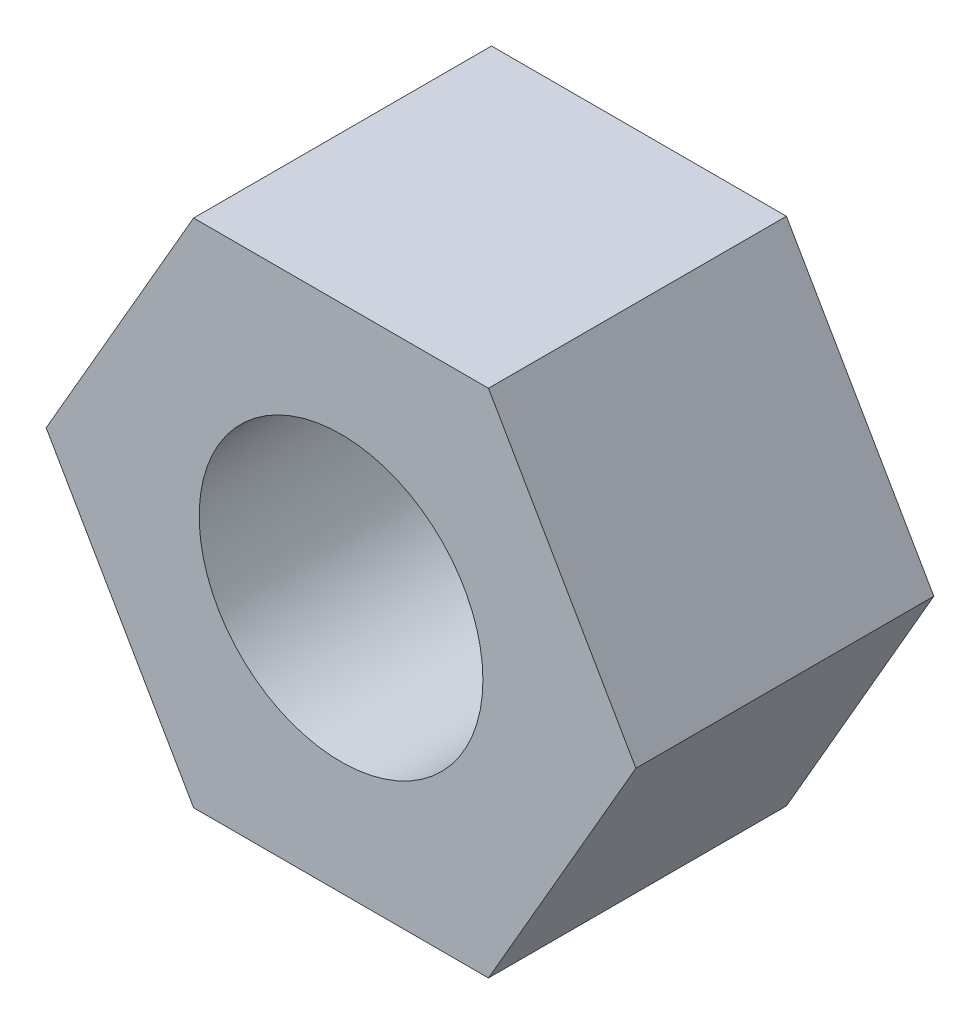
ISO-10303-21;
HEADER;
FILE_DESCRIPTION(('STEP AP214'),'2;1');
FILE_NAME('part.step','',(''),(''),'','','');
FILE_SCHEMA(('AUTOMOTIVE_DESIGN { 1 0 10303 214 1 1 1 1 }'));
ENDSEC;
DATA;
#1=APPLICATION_CONTEXT('core data for automotive mechanical design processes');
#2=APPLICATION_PROTOCOL_DEFINITION('international standard','automotive_design',2000,#1);
#3=PRODUCT_CONTEXT('',#1,'mechanical');
#4=PRODUCT('Part','Part','',(#3));
#5=PRODUCT_RELATED_PRODUCT_CATEGORY('part','',(#4));
#6=PRODUCT_DEFINITION_FORMATION('','',#4);
#7=PRODUCT_DEFINITION_CONTEXT('part definition',#1,'design');
#8=PRODUCT_DEFINITION('design','',#6,#7);
#9=PRODUCT_DEFINITION_SHAPE('','',#8);
#10=(LENGTH_UNIT() NAMED_UNIT(*) SI_UNIT(.MILLI.,.METRE.));
#11=(NAMED_UNIT(*) PLANE_ANGLE_UNIT() SI_UNIT($,.RADIAN.));
#12=(NAMED_UNIT(*) SI_UNIT($,.STERADIAN.) SOLID_ANGLE_UNIT());
#13=UNCERTAINTY_MEASURE_WITH_UNIT(LENGTH_MEASURE(1.E-05),#10,'distance_accuracy_value','');
#14=(GEOMETRIC_REPRESENTATION_CONTEXT(3) GLOBAL_UNCERTAINTY_ASSIGNED_CONTEXT((#13)) GLOBAL_UNIT_ASSIGNED_CONTEXT((#10,
#11,#12)) REPRESENTATION_CONTEXT('',''));
#15=CARTESIAN_POINT('',(0.,0.,0.));
#16=DIRECTION('',(0.,0.,1.));
#17=DIRECTION('',(1.,0.,0.));
#18=AXIS2_PLACEMENT_3D('',#15,#16,#17);
#19=CARTESIAN_POINT('',(-4.12444598552339,7.14375000000002,8.334375));
#20=DIRECTION('',(0.866025403784439,-0.5,0.));
#21=DIRECTION('',(0.5,0.866025403784439,0.));
#22=AXIS2_PLACEMENT_3D('',#19,#20,#21);
#23=PLANE('',#22);
#24=DIRECTION('',(-0.5,-0.866025403784439,0.));
#25=VECTOR('',#24,1.);
#26=CARTESIAN_POINT('',(-4.12444598552339,7.14375000000002,0.));
#27=LINE('',#26,#25);
#28=CARTESIAN_POINT('',(-4.12444598552339,7.14375000000002,0.));
#29=VERTEX_POINT('',#28);
#30=CARTESIAN_POINT('',(-8.24889197104679,0.,0.));
#31=VERTEX_POINT('',#30);
#32=EDGE_CURVE('E119',#29,#31,#27,.T.);
#33=ORIENTED_EDGE('',*,*,#32,.T.);
#34=DIRECTION('',(0.,0.,-1.));
#35=VECTOR('',#34,1.);
#36=CARTESIAN_POINT('',(-8.24889197104679,0.,8.334375));
#37=LINE('',#36,#35);
#38=CARTESIAN_POINT('',(-8.24889197104679,0.,8.334375));
#39=VERTEX_POINT('',#38);
#40=EDGE_CURVE('E11',#39,#31,#37,.T.);
#41=ORIENTED_EDGE('',*,*,#40,.F.);
#42=DIRECTION('',(-0.5,-0.866025403784439,0.));
#43=VECTOR('',#42,1.);
#44=CARTESIAN_POINT('',(-4.12444598552339,7.14375000000002,8.334375));
#45=LINE('',#44,#43);
#46=CARTESIAN_POINT('',(-4.12444598552339,7.14375000000002,8.334375));
#47=VERTEX_POINT('',#46);
#48=EDGE_CURVE('E130',#47,#39,#45,.T.);
#49=ORIENTED_EDGE('',*,*,#48,.F.);
#50=DIRECTION('',(0.,0.,-1.));
#51=VECTOR('',#50,1.);
#52=CARTESIAN_POINT('',(-4.12444598552339,7.14375000000002,8.334375));
#53=LINE('',#52,#51);
#54=EDGE_CURVE('E115',#47,#29,#53,.T.);
#55=ORIENTED_EDGE('',*,*,#54,.T.);
#56=EDGE_LOOP('',(#33,#41,#49,#55));
#57=FACE_BOUND('',#56,.T.);
#58=ADVANCED_FACE('F35',(#57),#23,.F.);
#59=CARTESIAN_POINT('',(-8.24889197104679,0.,8.334375));
#60=DIRECTION('',(0.866025403784439,0.5,0.));
#61=DIRECTION('',(-0.5,0.866025403784438,0.));
#62=AXIS2_PLACEMENT_3D('',#59,#60,#61);
#63=PLANE('',#62);
#64=DIRECTION('',(0.5,-0.866025403784438,0.));
#65=VECTOR('',#64,1.);
#66=CARTESIAN_POINT('',(-8.24889197104679,0.,0.));
#67=LINE('',#66,#65);
#68=CARTESIAN_POINT('',(-4.12444598552339,-7.14375,0.));
#69=VERTEX_POINT('',#68);
#70=EDGE_CURVE('E122',#31,#69,#67,.T.);
#71=ORIENTED_EDGE('',*,*,#70,.T.);
#72=DIRECTION('',(0.,0.,-1.));
#73=VECTOR('',#72,1.);
#74=CARTESIAN_POINT('',(-4.12444598552339,-7.14375,8.334375));
#75=LINE('',#74,#73);
#76=CARTESIAN_POINT('',(-4.12444598552339,-7.14375,8.334375));
#77=VERTEX_POINT('',#76);
#78=EDGE_CURVE('E43',#77,#69,#75,.T.);
#79=ORIENTED_EDGE('',*,*,#78,.F.);
#80=DIRECTION('',(0.5,-0.866025403784438,0.));
#81=VECTOR('',#80,1.);
#82=CARTESIAN_POINT('',(-8.24889197104679,0.,8.334375));
#83=LINE('',#82,#81);
#84=EDGE_CURVE('E88',#39,#77,#83,.T.);
#85=ORIENTED_EDGE('',*,*,#84,.F.);
#86=ORIENTED_EDGE('',*,*,#40,.T.);
#87=EDGE_LOOP('',(#71,#79,#85,#86));
#88=FACE_BOUND('',#87,.T.);
#89=ADVANCED_FACE('F155',(#88),#63,.F.);
#90=CARTESIAN_POINT('',(-4.12444598552339,-7.14375,8.334375));
#91=DIRECTION('',(0.,1.,0.));
#92=DIRECTION('',(0.,0.,1.));
#93=AXIS2_PLACEMENT_3D('',#90,#91,#92);
#94=PLANE('',#93);
#95=DIRECTION('',(1.,0.,0.));
#96=VECTOR('',#95,1.);
#97=CARTESIAN_POINT('',(-4.12444598552339,-7.14375,0.));
#98=LINE('',#97,#96);
#99=CARTESIAN_POINT('',(4.12444598552337,-7.14375,0.));
#100=VERTEX_POINT('',#99);
#101=EDGE_CURVE('E125',#69,#100,#98,.T.);
#102=ORIENTED_EDGE('',*,*,#101,.T.);
#103=DIRECTION('',(0.,0.,-1.));
#104=VECTOR('',#103,1.);
#105=CARTESIAN_POINT('',(4.12444598552337,-7.14375,8.334375));
#106=LINE('',#105,#104);
#107=CARTESIAN_POINT('',(4.12444598552337,-7.14375,8.334375));
#108=VERTEX_POINT('',#107);
#109=EDGE_CURVE('E110',#108,#100,#106,.T.);
#110=ORIENTED_EDGE('',*,*,#109,.F.);
#111=DIRECTION('',(1.,0.,0.));
#112=VECTOR('',#111,1.);
#113=CARTESIAN_POINT('',(-4.12444598552339,-7.14375,8.334375));
#114=LINE('',#113,#112);
#115=EDGE_CURVE('E101',#77,#108,#114,.T.);
#116=ORIENTED_EDGE('',*,*,#115,.F.);
#117=ORIENTED_EDGE('',*,*,#78,.T.);
#118=EDGE_LOOP('',(#102,#110,#116,#117));
#119=FACE_BOUND('',#118,.T.);
#120=ADVANCED_FACE('F136',(#119),#94,.F.);
#121=CARTESIAN_POINT('',(4.12444598552337,-7.14375,8.334375));
#122=DIRECTION('',(-0.866025403784439,0.5,0.));
#123=DIRECTION('',(-0.5,-0.866025403784439,0.));
#124=AXIS2_PLACEMENT_3D('',#121,#122,#123);
#125=PLANE('',#124);
#126=DIRECTION('',(0.5,0.866025403784439,0.));
#127=VECTOR('',#126,1.);
#128=CARTESIAN_POINT('',(4.12444598552337,-7.14375,0.));
#129=LINE('',#128,#127);
#130=CARTESIAN_POINT('',(8.24889197104676,0.,0.));
#131=VERTEX_POINT('',#130);
#132=EDGE_CURVE('E109',#100,#131,#129,.T.);
#133=ORIENTED_EDGE('',*,*,#132,.T.);
#134=DIRECTION('',(0.,0.,-1.));
#135=VECTOR('',#134,1.);
#136=CARTESIAN_POINT('',(8.24889197104676,0.,8.334375));
#137=LINE('',#136,#135);
#138=CARTESIAN_POINT('',(8.24889197104676,0.,8.334375));
#139=VERTEX_POINT('',#138);
#140=EDGE_CURVE('E106',#139,#131,#137,.T.);
#141=ORIENTED_EDGE('',*,*,#140,.F.);
#142=DIRECTION('',(0.5,0.866025403784439,0.));
#143=VECTOR('',#142,1.);
#144=CARTESIAN_POINT('',(4.12444598552337,-7.14375,8.334375));
#145=LINE('',#144,#143);
#146=EDGE_CURVE('E95',#108,#139,#145,.T.);
#147=ORIENTED_EDGE('',*,*,#146,.F.);
#148=ORIENTED_EDGE('',*,*,#109,.T.);
#149=EDGE_LOOP('',(#133,#141,#147,#148));
#150=FACE_BOUND('',#149,.T.);
#151=ADVANCED_FACE('F107',(#150),#125,.F.);
#152=CARTESIAN_POINT('',(8.24889197104676,0.,8.334375));
#153=DIRECTION('',(-0.866025403784439,-0.5,0.));
#154=DIRECTION('',(0.5,-0.866025403784439,0.));
#155=AXIS2_PLACEMENT_3D('',#152,#153,#154);
#156=PLANE('',#155);
#157=DIRECTION('',(-0.5,0.866025403784439,0.));
#158=VECTOR('',#157,1.);
#159=CARTESIAN_POINT('',(8.24889197104676,0.,0.));
#160=LINE('',#159,#158);
#161=CARTESIAN_POINT('',(4.12444598552336,7.14375000000002,0.));
#162=VERTEX_POINT('',#161);
#163=EDGE_CURVE('E74',#131,#162,#160,.T.);
#164=ORIENTED_EDGE('',*,*,#163,.T.);
#165=DIRECTION('',(0.,0.,-1.));
#166=VECTOR('',#165,1.);
#167=CARTESIAN_POINT('',(4.12444598552336,7.14375000000002,8.334375));
#168=LINE('',#167,#166);
#169=CARTESIAN_POINT('',(4.12444598552336,7.14375000000002,8.334375));
#170=VERTEX_POINT('',#169);
#171=EDGE_CURVE('E111',#170,#162,#168,.T.);
#172=ORIENTED_EDGE('',*,*,#171,.F.);
#173=DIRECTION('',(-0.5,0.866025403784439,0.));
#174=VECTOR('',#173,1.);
#175=CARTESIAN_POINT('',(8.24889197104676,0.,8.334375));
#176=LINE('',#175,#174);
#177=EDGE_CURVE('E99',#139,#170,#176,.T.);
#178=ORIENTED_EDGE('',*,*,#177,.F.);
#179=ORIENTED_EDGE('',*,*,#140,.T.);
#180=EDGE_LOOP('',(#164,#172,#178,#179));
#181=FACE_BOUND('',#180,.T.);
#182=ADVANCED_FACE('F113',(#181),#156,.F.);
#183=CARTESIAN_POINT('',(4.12444598552336,7.14375000000002,8.334375));
#184=DIRECTION('',(0.,-1.,0.));
#185=DIRECTION('',(0.,0.,-1.));
#186=AXIS2_PLACEMENT_3D('',#183,#184,#185);
#187=PLANE('',#186);
#188=DIRECTION('',(-1.,0.,0.));
#189=VECTOR('',#188,1.);
#190=CARTESIAN_POINT('',(4.12444598552336,7.14375000000002,0.));
#191=LINE('',#190,#189);
#192=EDGE_CURVE('E80',#162,#29,#191,.T.);
#193=ORIENTED_EDGE('',*,*,#192,.T.);
#194=ORIENTED_EDGE('',*,*,#54,.F.);
#195=DIRECTION('',(-1.,0.,0.));
#196=VECTOR('',#195,1.);
#197=CARTESIAN_POINT('',(4.12444598552336,7.14375000000002,8.334375));
#198=LINE('',#197,#196);
#199=EDGE_CURVE('E51',#170,#47,#198,.T.);
#200=ORIENTED_EDGE('',*,*,#199,.F.);
#201=ORIENTED_EDGE('',*,*,#171,.T.);
#202=EDGE_LOOP('',(#193,#194,#200,#201));
#203=FACE_BOUND('',#202,.T.);
#204=ADVANCED_FACE('F143',(#203),#187,.F.);
#205=CARTESIAN_POINT('',(0.,0.,8.334375));
#206=DIRECTION('',(0.,0.,1.));
#207=DIRECTION('',(1.,0.,0.));
#208=AXIS2_PLACEMENT_3D('',#205,#206,#207);
#209=PLANE('',#208);
#210=CARTESIAN_POINT('',(0.,0.,8.334375));
#211=DIRECTION('',(0.,0.,1.));
#212=DIRECTION('',(1.,0.,0.));
#213=AXIS2_PLACEMENT_3D('',#210,#211,#212);
#214=CIRCLE('',#213,3.96875);
#215=CARTESIAN_POINT('',(3.96875,0.,8.334375));
#216=VERTEX_POINT('',#215);
#217=EDGE_CURVE('E212',#216,#216,#214,.T.);
#218=ORIENTED_EDGE('',*,*,#217,.F.);
#219=EDGE_LOOP('',(#218));
#220=FACE_BOUND('',#219,.T.);
#221=ORIENTED_EDGE('',*,*,#48,.T.);
#222=ORIENTED_EDGE('',*,*,#84,.T.);
#223=ORIENTED_EDGE('',*,*,#115,.T.);
#224=ORIENTED_EDGE('',*,*,#146,.T.);
#225=ORIENTED_EDGE('',*,*,#177,.T.);
#226=ORIENTED_EDGE('',*,*,#199,.T.);
#227=EDGE_LOOP('',(#221,#222,#223,#224,#225,#226));
#228=FACE_BOUND('',#227,.T.);
#229=ADVANCED_FACE('F97',(#220,#228),#209,.T.);
#230=CARTESIAN_POINT('',(0.,0.,0.));
#231=DIRECTION('',(0.,0.,1.));
#232=DIRECTION('',(1.,0.,0.));
#233=AXIS2_PLACEMENT_3D('',#230,#231,#232);
#234=PLANE('',#233);
#235=CARTESIAN_POINT('',(0.,0.,0.));
#236=DIRECTION('',(0.,0.,1.));
#237=DIRECTION('',(1.,0.,0.));
#238=AXIS2_PLACEMENT_3D('',#235,#236,#237);
#239=CIRCLE('',#238,3.96875);
#240=CARTESIAN_POINT('',(3.96875,0.,0.));
#241=VERTEX_POINT('',#240);
#242=EDGE_CURVE('E123',#241,#241,#239,.T.);
#243=ORIENTED_EDGE('',*,*,#242,.T.);
#244=EDGE_LOOP('',(#243));
#245=FACE_BOUND('',#244,.T.);
#246=ORIENTED_EDGE('',*,*,#32,.F.);
#247=ORIENTED_EDGE('',*,*,#192,.F.);
#248=ORIENTED_EDGE('',*,*,#163,.F.);
#249=ORIENTED_EDGE('',*,*,#132,.F.);
#250=ORIENTED_EDGE('',*,*,#101,.F.);
#251=ORIENTED_EDGE('',*,*,#70,.F.);
#252=EDGE_LOOP('',(#246,#247,#248,#249,#250,#251));
#253=FACE_BOUND('',#252,.T.);
#254=ADVANCED_FACE('F139',(#245,#253),#234,.F.);
#255=CARTESIAN_POINT('',(0.,0.,8.334375));
#256=DIRECTION('',(0.,0.,1.));
#257=DIRECTION('',(1.,0.,0.));
#258=AXIS2_PLACEMENT_3D('',#255,#256,#257);
#259=CYLINDRICAL_SURFACE('',#258,3.96875);
#260=ORIENTED_EDGE('',*,*,#242,.F.);
#261=EDGE_LOOP('',(#260));
#262=FACE_BOUND('',#261,.T.);
#263=ORIENTED_EDGE('',*,*,#217,.T.);
#264=EDGE_LOOP('',(#263));
#265=FACE_BOUND('',#264,.T.);
#266=ADVANCED_FACE('F192',(#262,#265),#259,.F.);
#267=CLOSED_SHELL('',(#58,#89,#120,#151,#182,#204,#229,#254,#266));
#268=MANIFOLD_SOLID_BREP('B2',#267);
#269=ADVANCED_BREP_SHAPE_REPRESENTATION('',(#18,#268),#14);
#270=SHAPE_DEFINITION_REPRESENTATION(#9,#269);
ENDSEC;
END-ISO-10303-21;
